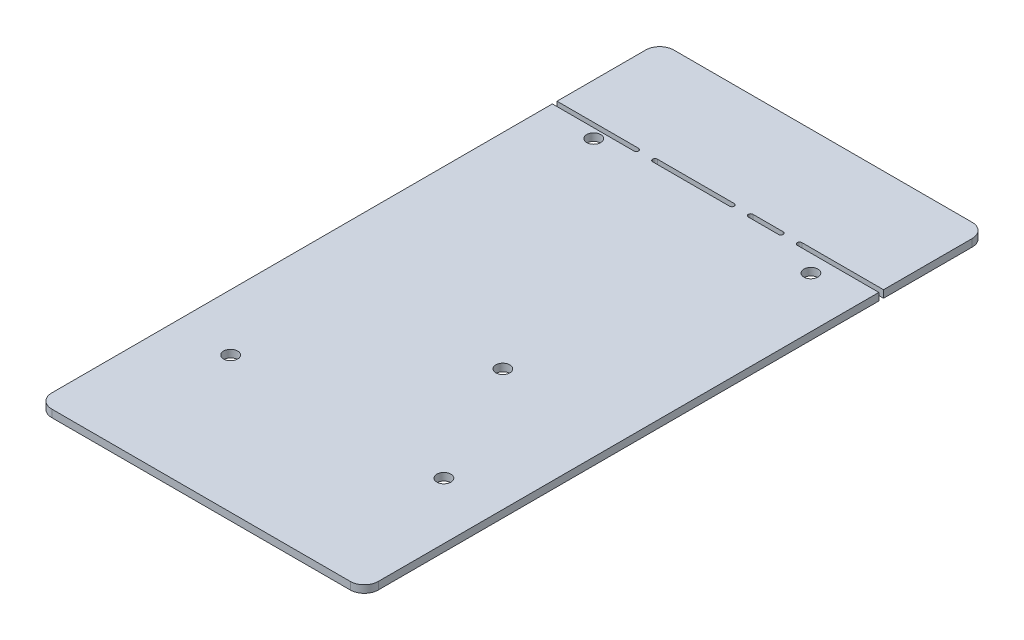
ISO-10303-21;
HEADER;
FILE_DESCRIPTION(('STEP AP214'),'2;1');
FILE_NAME('part.step','',(''),(''),'','','');
FILE_SCHEMA(('AUTOMOTIVE_DESIGN { 1 0 10303 214 1 1 1 1 }'));
ENDSEC;
DATA;
#1=APPLICATION_CONTEXT('core data for automotive mechanical design processes');
#2=APPLICATION_PROTOCOL_DEFINITION('international standard','automotive_design',2000,#1);
#3=PRODUCT_CONTEXT('',#1,'mechanical');
#4=PRODUCT('Part','Part','',(#3));
#5=PRODUCT_RELATED_PRODUCT_CATEGORY('part','',(#4));
#6=PRODUCT_DEFINITION_FORMATION('','',#4);
#7=PRODUCT_DEFINITION_CONTEXT('part definition',#1,'design');
#8=PRODUCT_DEFINITION('design','',#6,#7);
#9=PRODUCT_DEFINITION_SHAPE('','',#8);
#10=(LENGTH_UNIT() NAMED_UNIT(*) SI_UNIT(.MILLI.,.METRE.));
#11=(NAMED_UNIT(*) PLANE_ANGLE_UNIT() SI_UNIT($,.RADIAN.));
#12=(NAMED_UNIT(*) SI_UNIT($,.STERADIAN.) SOLID_ANGLE_UNIT());
#13=UNCERTAINTY_MEASURE_WITH_UNIT(LENGTH_MEASURE(1.E-05),#10,'distance_accuracy_value','');
#14=(GEOMETRIC_REPRESENTATION_CONTEXT(3) GLOBAL_UNCERTAINTY_ASSIGNED_CONTEXT((#13)) GLOBAL_UNIT_ASSIGNED_CONTEXT((#10,
#11,#12)) REPRESENTATION_CONTEXT('',''));
#15=CARTESIAN_POINT('',(0.,0.,0.));
#16=DIRECTION('',(0.,0.,1.));
#17=DIRECTION('',(1.,0.,0.));
#18=AXIS2_PLACEMENT_3D('',#15,#16,#17);
#19=CARTESIAN_POINT('',(35.,1.6,-66.67));
#20=DIRECTION('',(-1.,0.,0.));
#21=DIRECTION('',(0.,0.,1.));
#22=AXIS2_PLACEMENT_3D('',#19,#20,#21);
#23=PLANE('',#22);
#24=DIRECTION('',(0.,0.,-1.));
#25=VECTOR('',#24,1.);
#26=CARTESIAN_POINT('',(35.,0.,-66.67));
#27=LINE('',#26,#25);
#28=CARTESIAN_POINT('',(35.,0.,-44.65));
#29=VERTEX_POINT('',#28);
#30=CARTESIAN_POINT('',(35.,0.,-63.67));
#31=VERTEX_POINT('',#30);
#32=EDGE_CURVE('E253',#29,#31,#27,.T.);
#33=ORIENTED_EDGE('',*,*,#32,.T.);
#34=DIRECTION('',(0.,-1.,0.));
#35=VECTOR('',#34,1.);
#36=CARTESIAN_POINT('',(35.,1.6,-63.67));
#37=LINE('',#36,#35);
#38=CARTESIAN_POINT('',(35.,1.6,-63.67));
#39=VERTEX_POINT('',#38);
#40=EDGE_CURVE('E356',#31,#39,#37,.F.);
#41=ORIENTED_EDGE('',*,*,#40,.T.);
#42=DIRECTION('',(0.,0.,-1.));
#43=VECTOR('',#42,1.);
#44=CARTESIAN_POINT('',(35.,1.6,-66.67));
#45=LINE('',#44,#43);
#46=CARTESIAN_POINT('',(35.,1.6,-44.65));
#47=VERTEX_POINT('',#46);
#48=EDGE_CURVE('E308',#47,#39,#45,.T.);
#49=ORIENTED_EDGE('',*,*,#48,.F.);
#50=DIRECTION('',(0.,1.,0.));
#51=VECTOR('',#50,1.);
#52=CARTESIAN_POINT('',(35.,0.,-44.65));
#53=LINE('',#52,#51);
#54=EDGE_CURVE('E259',#29,#47,#53,.T.);
#55=ORIENTED_EDGE('',*,*,#54,.F.);
#56=EDGE_LOOP('',(#33,#41,#49,#55));
#57=FACE_BOUND('',#56,.T.);
#58=ADVANCED_FACE('F35',(#57),#23,.F.);
#59=CARTESIAN_POINT('',(-35.,1.6,-66.67));
#60=DIRECTION('',(1.,0.,0.));
#61=DIRECTION('',(0.,0.,-1.));
#62=AXIS2_PLACEMENT_3D('',#59,#60,#61);
#63=PLANE('',#62);
#64=DIRECTION('',(0.,0.,1.));
#65=VECTOR('',#64,1.);
#66=CARTESIAN_POINT('',(-35.,1.6,-66.67));
#67=LINE('',#66,#65);
#68=CARTESIAN_POINT('',(-35.,1.6,-63.67));
#69=VERTEX_POINT('',#68);
#70=CARTESIAN_POINT('',(-35.,1.6,-44.65));
#71=VERTEX_POINT('',#70);
#72=EDGE_CURVE('E312',#69,#71,#67,.T.);
#73=ORIENTED_EDGE('',*,*,#72,.F.);
#74=DIRECTION('',(0.,-1.,0.));
#75=VECTOR('',#74,1.);
#76=CARTESIAN_POINT('',(-35.,1.6,-63.67));
#77=LINE('',#76,#75);
#78=CARTESIAN_POINT('',(-35.,0.,-63.67));
#79=VERTEX_POINT('',#78);
#80=EDGE_CURVE('E358',#69,#79,#77,.T.);
#81=ORIENTED_EDGE('',*,*,#80,.T.);
#82=DIRECTION('',(0.,0.,1.));
#83=VECTOR('',#82,1.);
#84=CARTESIAN_POINT('',(-35.,0.,-66.67));
#85=LINE('',#84,#83);
#86=CARTESIAN_POINT('',(-35.,0.,-44.65));
#87=VERTEX_POINT('',#86);
#88=EDGE_CURVE('E321',#79,#87,#85,.T.);
#89=ORIENTED_EDGE('',*,*,#88,.T.);
#90=DIRECTION('',(0.,1.,0.));
#91=VECTOR('',#90,1.);
#92=CARTESIAN_POINT('',(-35.,0.,-44.65));
#93=LINE('',#92,#91);
#94=EDGE_CURVE('E272',#87,#71,#93,.T.);
#95=ORIENTED_EDGE('',*,*,#94,.T.);
#96=EDGE_LOOP('',(#73,#81,#89,#95));
#97=FACE_BOUND('',#96,.T.);
#98=ADVANCED_FACE('F528',(#97),#63,.F.);
#99=CARTESIAN_POINT('',(35.,1.6,63.67));
#100=VERTEX_POINT('',#99);
#101=CARTESIAN_POINT('',(35.,1.6,-43.65));
#102=VERTEX_POINT('',#101);
#103=EDGE_CURVE('E305',#100,#102,#45,.T.);
#104=ORIENTED_EDGE('',*,*,#103,.F.);
#105=DIRECTION('',(0.,-1.,0.));
#106=VECTOR('',#105,1.);
#107=CARTESIAN_POINT('',(35.,1.6,63.67));
#108=LINE('',#107,#106);
#109=CARTESIAN_POINT('',(35.,0.,63.67));
#110=VERTEX_POINT('',#109);
#111=EDGE_CURVE('E251',#100,#110,#108,.T.);
#112=ORIENTED_EDGE('',*,*,#111,.T.);
#113=CARTESIAN_POINT('',(35.,0.,-43.65));
#114=VERTEX_POINT('',#113);
#115=EDGE_CURVE('E236',#110,#114,#27,.T.);
#116=ORIENTED_EDGE('',*,*,#115,.T.);
#117=DIRECTION('',(0.,1.,0.));
#118=VECTOR('',#117,1.);
#119=CARTESIAN_POINT('',(35.,0.,-43.65));
#120=LINE('',#119,#118);
#121=EDGE_CURVE('E242',#114,#102,#120,.T.);
#122=ORIENTED_EDGE('',*,*,#121,.T.);
#123=EDGE_LOOP('',(#104,#112,#116,#122));
#124=FACE_BOUND('',#123,.T.);
#125=ADVANCED_FACE('F249',(#124),#23,.F.);
#126=CARTESIAN_POINT('',(-35.,1.6,-66.67));
#127=DIRECTION('',(0.,0.,1.));
#128=DIRECTION('',(1.,0.,0.));
#129=AXIS2_PLACEMENT_3D('',#126,#127,#128);
#130=PLANE('',#129);
#131=DIRECTION('',(-1.,0.,0.));
#132=VECTOR('',#131,1.);
#133=CARTESIAN_POINT('',(-35.,1.6,-66.67));
#134=LINE('',#133,#132);
#135=CARTESIAN_POINT('',(32.,1.6,-66.67));
#136=VERTEX_POINT('',#135);
#137=CARTESIAN_POINT('',(-32.,1.6,-66.67));
#138=VERTEX_POINT('',#137);
#139=EDGE_CURVE('E307',#136,#138,#134,.T.);
#140=ORIENTED_EDGE('',*,*,#139,.F.);
#141=DIRECTION('',(0.,-1.,0.));
#142=VECTOR('',#141,1.);
#143=CARTESIAN_POINT('',(32.,1.6,-66.67));
#144=LINE('',#143,#142);
#145=CARTESIAN_POINT('',(32.,0.,-66.67));
#146=VERTEX_POINT('',#145);
#147=EDGE_CURVE('E353',#136,#146,#144,.T.);
#148=ORIENTED_EDGE('',*,*,#147,.T.);
#149=DIRECTION('',(-1.,0.,0.));
#150=VECTOR('',#149,1.);
#151=CARTESIAN_POINT('',(-35.,0.,-66.67));
#152=LINE('',#151,#150);
#153=CARTESIAN_POINT('',(-32.,0.,-66.67));
#154=VERTEX_POINT('',#153);
#155=EDGE_CURVE('E252',#146,#154,#152,.T.);
#156=ORIENTED_EDGE('',*,*,#155,.T.);
#157=DIRECTION('',(0.,-1.,0.));
#158=VECTOR('',#157,1.);
#159=CARTESIAN_POINT('',(-32.,1.6,-66.67));
#160=LINE('',#159,#158);
#161=EDGE_CURVE('E351',#154,#138,#160,.F.);
#162=ORIENTED_EDGE('',*,*,#161,.T.);
#163=EDGE_LOOP('',(#140,#148,#156,#162));
#164=FACE_BOUND('',#163,.T.);
#165=ADVANCED_FACE('F541',(#164),#130,.F.);
#166=CARTESIAN_POINT('',(-35.,0.,-43.65));
#167=VERTEX_POINT('',#166);
#168=CARTESIAN_POINT('',(-35.,0.,63.67));
#169=VERTEX_POINT('',#168);
#170=EDGE_CURVE('E320',#167,#169,#85,.T.);
#171=ORIENTED_EDGE('',*,*,#170,.T.);
#172=DIRECTION('',(0.,-1.,0.));
#173=VECTOR('',#172,1.);
#174=CARTESIAN_POINT('',(-35.,1.6,63.67));
#175=LINE('',#174,#173);
#176=CARTESIAN_POINT('',(-35.,1.6,63.67));
#177=VERTEX_POINT('',#176);
#178=EDGE_CURVE('E349',#169,#177,#175,.F.);
#179=ORIENTED_EDGE('',*,*,#178,.T.);
#180=CARTESIAN_POINT('',(-35.,1.6,-43.65));
#181=VERTEX_POINT('',#180);
#182=EDGE_CURVE('E311',#181,#177,#67,.T.);
#183=ORIENTED_EDGE('',*,*,#182,.F.);
#184=DIRECTION('',(0.,1.,0.));
#185=VECTOR('',#184,1.);
#186=CARTESIAN_POINT('',(-35.,0.,-43.65));
#187=LINE('',#186,#185);
#188=EDGE_CURVE('E279',#167,#181,#187,.T.);
#189=ORIENTED_EDGE('',*,*,#188,.F.);
#190=EDGE_LOOP('',(#171,#179,#183,#189));
#191=FACE_BOUND('',#190,.T.);
#192=ADVANCED_FACE('F536',(#191),#63,.F.);
#193=CARTESIAN_POINT('',(-35.,1.6,66.67));
#194=DIRECTION('',(0.,0.,-1.));
#195=DIRECTION('',(-1.,0.,0.));
#196=AXIS2_PLACEMENT_3D('',#193,#194,#195);
#197=PLANE('',#196);
#198=DIRECTION('',(1.,0.,0.));
#199=VECTOR('',#198,1.);
#200=CARTESIAN_POINT('',(-35.,0.,66.67));
#201=LINE('',#200,#199);
#202=CARTESIAN_POINT('',(-32.,0.,66.67));
#203=VERTEX_POINT('',#202);
#204=CARTESIAN_POINT('',(32.,0.,66.67));
#205=VERTEX_POINT('',#204);
#206=EDGE_CURVE('E324',#203,#205,#201,.T.);
#207=ORIENTED_EDGE('',*,*,#206,.T.);
#208=DIRECTION('',(0.,-1.,0.));
#209=VECTOR('',#208,1.);
#210=CARTESIAN_POINT('',(32.,1.6,66.67));
#211=LINE('',#210,#209);
#212=CARTESIAN_POINT('',(32.,1.6,66.67));
#213=VERTEX_POINT('',#212);
#214=EDGE_CURVE('E339',#205,#213,#211,.F.);
#215=ORIENTED_EDGE('',*,*,#214,.T.);
#216=DIRECTION('',(1.,0.,0.));
#217=VECTOR('',#216,1.);
#218=CARTESIAN_POINT('',(-35.,1.6,66.67));
#219=LINE('',#218,#217);
#220=CARTESIAN_POINT('',(-32.,1.6,66.67));
#221=VERTEX_POINT('',#220);
#222=EDGE_CURVE('E315',#221,#213,#219,.T.);
#223=ORIENTED_EDGE('',*,*,#222,.F.);
#224=DIRECTION('',(0.,-1.,0.));
#225=VECTOR('',#224,1.);
#226=CARTESIAN_POINT('',(-32.,1.6,66.67));
#227=LINE('',#226,#225);
#228=EDGE_CURVE('E336',#221,#203,#227,.T.);
#229=ORIENTED_EDGE('',*,*,#228,.T.);
#230=EDGE_LOOP('',(#207,#215,#223,#229));
#231=FACE_BOUND('',#230,.T.);
#232=ADVANCED_FACE('F549',(#231),#197,.F.);
#233=CARTESIAN_POINT('',(0.,1.6,0.));
#234=DIRECTION('',(0.,1.,0.));
#235=DIRECTION('',(0.,0.,1.));
#236=AXIS2_PLACEMENT_3D('',#233,#234,#235);
#237=PLANE('',#236);
#238=ORIENTED_EDGE('',*,*,#222,.T.);
#239=CARTESIAN_POINT('',(32.,1.6,63.67));
#240=DIRECTION('',(0.,1.,0.));
#241=DIRECTION('',(0.,0.,1.));
#242=AXIS2_PLACEMENT_3D('',#239,#240,#241);
#243=CIRCLE('',#242,3.);
#244=EDGE_CURVE('E347',#213,#100,#243,.T.);
#245=ORIENTED_EDGE('',*,*,#244,.T.);
#246=ORIENTED_EDGE('',*,*,#103,.T.);
#247=DIRECTION('',(1.,0.,0.));
#248=VECTOR('',#247,1.);
#249=CARTESIAN_POINT('',(35.,1.6,-43.65));
#250=LINE('',#249,#248);
#251=CARTESIAN_POINT('',(17.5,1.6,-43.65));
#252=VERTEX_POINT('',#251);
#253=EDGE_CURVE('E257',#252,#102,#250,.T.);
#254=ORIENTED_EDGE('',*,*,#253,.F.);
#255=CARTESIAN_POINT('',(17.5,1.6,-44.15));
#256=DIRECTION('',(0.,1.,0.));
#257=DIRECTION('',(0.,0.,1.));
#258=AXIS2_PLACEMENT_3D('',#255,#256,#257);
#259=CIRCLE('',#258,0.5);
#260=CARTESIAN_POINT('',(17.,1.6,-44.15));
#261=VERTEX_POINT('',#260);
#262=EDGE_CURVE('E395',#252,#261,#259,.F.);
#263=ORIENTED_EDGE('',*,*,#262,.T.);
#264=CARTESIAN_POINT('',(17.5,1.6,-44.15));
#265=DIRECTION('',(0.,1.,0.));
#266=DIRECTION('',(0.,0.,1.));
#267=AXIS2_PLACEMENT_3D('',#264,#265,#266);
#268=CIRCLE('',#267,0.5);
#269=CARTESIAN_POINT('',(17.5,1.6,-44.65));
#270=VERTEX_POINT('',#269);
#271=EDGE_CURVE('E391',#261,#270,#268,.F.);
#272=ORIENTED_EDGE('',*,*,#271,.T.);
#273=DIRECTION('',(-1.,0.,0.));
#274=VECTOR('',#273,1.);
#275=CARTESIAN_POINT('',(35.,1.6,-44.65));
#276=LINE('',#275,#274);
#277=EDGE_CURVE('E478',#47,#270,#276,.T.);
#278=ORIENTED_EDGE('',*,*,#277,.F.);
#279=ORIENTED_EDGE('',*,*,#48,.T.);
#280=CARTESIAN_POINT('',(32.,1.6,-63.67));
#281=DIRECTION('',(0.,1.,0.));
#282=DIRECTION('',(0.,0.,1.));
#283=AXIS2_PLACEMENT_3D('',#280,#281,#282);
#284=CIRCLE('',#283,3.);
#285=EDGE_CURVE('E343',#39,#136,#284,.T.);
#286=ORIENTED_EDGE('',*,*,#285,.T.);
#287=ORIENTED_EDGE('',*,*,#139,.T.);
#288=CARTESIAN_POINT('',(-32.,1.6,-63.67));
#289=DIRECTION('',(0.,1.,0.));
#290=DIRECTION('',(0.,0.,1.));
#291=AXIS2_PLACEMENT_3D('',#288,#289,#290);
#292=CIRCLE('',#291,3.);
#293=EDGE_CURVE('E341',#138,#69,#292,.T.);
#294=ORIENTED_EDGE('',*,*,#293,.T.);
#295=ORIENTED_EDGE('',*,*,#72,.T.);
#296=DIRECTION('',(-1.,0.,0.));
#297=VECTOR('',#296,1.);
#298=CARTESIAN_POINT('',(-35.,1.6,-44.65));
#299=LINE('',#298,#297);
#300=CARTESIAN_POINT('',(-17.5,1.6,-44.65));
#301=VERTEX_POINT('',#300);
#302=EDGE_CURVE('E277',#301,#71,#299,.T.);
#303=ORIENTED_EDGE('',*,*,#302,.F.);
#304=CARTESIAN_POINT('',(-17.5,1.6,-44.15));
#305=DIRECTION('',(0.,1.,0.));
#306=DIRECTION('',(0.,0.,1.));
#307=AXIS2_PLACEMENT_3D('',#304,#305,#306);
#308=CIRCLE('',#307,0.5);
#309=CARTESIAN_POINT('',(-17.,1.6,-44.15));
#310=VERTEX_POINT('',#309);
#311=EDGE_CURVE('E422',#301,#310,#308,.F.);
#312=ORIENTED_EDGE('',*,*,#311,.T.);
#313=CARTESIAN_POINT('',(-17.5,1.6,-44.15));
#314=DIRECTION('',(0.,1.,0.));
#315=DIRECTION('',(0.,0.,1.));
#316=AXIS2_PLACEMENT_3D('',#313,#314,#315);
#317=CIRCLE('',#316,0.5);
#318=CARTESIAN_POINT('',(-17.5,1.6,-43.65));
#319=VERTEX_POINT('',#318);
#320=EDGE_CURVE('E426',#310,#319,#317,.F.);
#321=ORIENTED_EDGE('',*,*,#320,.T.);
#322=DIRECTION('',(1.,0.,0.));
#323=VECTOR('',#322,1.);
#324=CARTESIAN_POINT('',(-35.,1.6,-43.65));
#325=LINE('',#324,#323);
#326=EDGE_CURVE('E280',#181,#319,#325,.T.);
#327=ORIENTED_EDGE('',*,*,#326,.F.);
#328=ORIENTED_EDGE('',*,*,#182,.T.);
#329=CARTESIAN_POINT('',(-32.,1.6,63.67));
#330=DIRECTION('',(0.,1.,0.));
#331=DIRECTION('',(0.,0.,1.));
#332=AXIS2_PLACEMENT_3D('',#329,#330,#331);
#333=CIRCLE('',#332,3.);
#334=EDGE_CURVE('E345',#177,#221,#333,.T.);
#335=ORIENTED_EDGE('',*,*,#334,.T.);
#336=EDGE_LOOP('',(#238,#245,#246,#254,#263,#272,#278,#279,#286,#287,#294,#295,#303,#312,#321,
#327,#328,#335));
#337=FACE_BOUND('',#336,.T.);
#338=CARTESIAN_POINT('',(24.13,1.6,-39.95));
#339=DIRECTION('',(0.,1.,0.));
#340=DIRECTION('',(0.,0.,1.));
#341=AXIS2_PLACEMENT_3D('',#338,#339,#340);
#342=CIRCLE('',#341,1.5);
#343=CARTESIAN_POINT('',(24.13,1.6,-38.45));
#344=VERTEX_POINT('',#343);
#345=EDGE_CURVE('E269',#344,#344,#342,.T.);
#346=ORIENTED_EDGE('',*,*,#345,.F.);
#347=EDGE_LOOP('',(#346));
#348=FACE_BOUND('',#347,.T.);
#349=CARTESIAN_POINT('',(-24.13,1.6,-41.65));
#350=DIRECTION('',(0.,1.,0.));
#351=DIRECTION('',(0.,0.,1.));
#352=AXIS2_PLACEMENT_3D('',#349,#350,#351);
#353=CIRCLE('',#352,1.5);
#354=CARTESIAN_POINT('',(-24.13,1.6,-40.15));
#355=VERTEX_POINT('',#354);
#356=EDGE_CURVE('E268',#355,#355,#353,.T.);
#357=ORIENTED_EDGE('',*,*,#356,.F.);
#358=EDGE_LOOP('',(#357));
#359=FACE_BOUND('',#358,.T.);
#360=CARTESIAN_POINT('',(22.86,1.6,37.46));
#361=DIRECTION('',(0.,1.,0.));
#362=DIRECTION('',(0.,0.,-1.));
#363=AXIS2_PLACEMENT_3D('',#360,#361,#362);
#364=CIRCLE('',#363,1.5);
#365=CARTESIAN_POINT('',(22.86,1.6,35.96));
#366=VERTEX_POINT('',#365);
#367=EDGE_CURVE('E292',#366,#366,#364,.T.);
#368=ORIENTED_EDGE('',*,*,#367,.F.);
#369=EDGE_LOOP('',(#368));
#370=FACE_BOUND('',#369,.T.);
#371=CARTESIAN_POINT('',(8.88999999999999,1.6,10.85));
#372=DIRECTION('',(0.,1.,0.));
#373=DIRECTION('',(0.,0.,1.));
#374=AXIS2_PLACEMENT_3D('',#371,#372,#373);
#375=CIRCLE('',#374,1.5);
#376=CARTESIAN_POINT('',(8.88999999999999,1.6,12.35));
#377=VERTEX_POINT('',#376);
#378=EDGE_CURVE('E437',#377,#377,#375,.T.);
#379=ORIENTED_EDGE('',*,*,#378,.F.);
#380=EDGE_LOOP('',(#379));
#381=FACE_BOUND('',#380,.T.);
#382=DIRECTION('',(1.,0.,0.));
#383=VECTOR('',#382,1.);
#384=CARTESIAN_POINT('',(6.5,1.6,-43.65));
#385=LINE('',#384,#383);
#386=CARTESIAN_POINT('',(7.,1.6,-43.65));
#387=VERTEX_POINT('',#386);
#388=CARTESIAN_POINT('',(13.5,1.6,-43.65));
#389=VERTEX_POINT('',#388);
#390=EDGE_CURVE('E493',#387,#389,#385,.T.);
#391=ORIENTED_EDGE('',*,*,#390,.F.);
#392=CARTESIAN_POINT('',(7.,1.6,-44.15));
#393=DIRECTION('',(0.,1.,0.));
#394=DIRECTION('',(0.,0.,1.));
#395=AXIS2_PLACEMENT_3D('',#392,#393,#394);
#396=CIRCLE('',#395,0.5);
#397=CARTESIAN_POINT('',(6.5,1.6,-44.15));
#398=VERTEX_POINT('',#397);
#399=EDGE_CURVE('E410',#387,#398,#396,.F.);
#400=ORIENTED_EDGE('',*,*,#399,.T.);
#401=CARTESIAN_POINT('',(7.,1.6,-44.15));
#402=DIRECTION('',(0.,1.,0.));
#403=DIRECTION('',(0.,0.,1.));
#404=AXIS2_PLACEMENT_3D('',#401,#402,#403);
#405=CIRCLE('',#404,0.5);
#406=CARTESIAN_POINT('',(7.,1.6,-44.65));
#407=VERTEX_POINT('',#406);
#408=EDGE_CURVE('E406',#398,#407,#405,.F.);
#409=ORIENTED_EDGE('',*,*,#408,.T.);
#410=DIRECTION('',(-1.,0.,0.));
#411=VECTOR('',#410,1.);
#412=CARTESIAN_POINT('',(6.5,1.6,-44.65));
#413=LINE('',#412,#411);
#414=CARTESIAN_POINT('',(13.5,1.6,-44.65));
#415=VERTEX_POINT('',#414);
#416=EDGE_CURVE('E490',#415,#407,#413,.T.);
#417=ORIENTED_EDGE('',*,*,#416,.F.);
#418=CARTESIAN_POINT('',(13.5,1.6,-44.15));
#419=DIRECTION('',(0.,1.,0.));
#420=DIRECTION('',(0.,0.,1.));
#421=AXIS2_PLACEMENT_3D('',#418,#419,#420);
#422=CIRCLE('',#421,0.5);
#423=CARTESIAN_POINT('',(14.,1.6,-44.15));
#424=VERTEX_POINT('',#423);
#425=EDGE_CURVE('E402',#415,#424,#422,.F.);
#426=ORIENTED_EDGE('',*,*,#425,.T.);
#427=CARTESIAN_POINT('',(13.5,1.6,-44.15));
#428=DIRECTION('',(0.,1.,0.));
#429=DIRECTION('',(0.,0.,1.));
#430=AXIS2_PLACEMENT_3D('',#427,#428,#429);
#431=CIRCLE('',#430,0.5);
#432=EDGE_CURVE('E398',#424,#389,#431,.F.);
#433=ORIENTED_EDGE('',*,*,#432,.T.);
#434=EDGE_LOOP('',(#391,#400,#409,#417,#426,#433));
#435=FACE_BOUND('',#434,.T.);
#436=CARTESIAN_POINT('',(-13.5,1.6,-44.15));
#437=DIRECTION('',(0.,1.,0.));
#438=DIRECTION('',(0.,0.,1.));
#439=AXIS2_PLACEMENT_3D('',#436,#437,#438);
#440=CIRCLE('',#439,0.5);
#441=CARTESIAN_POINT('',(-13.5,1.6,-43.65));
#442=VERTEX_POINT('',#441);
#443=CARTESIAN_POINT('',(-14.,1.6,-44.15));
#444=VERTEX_POINT('',#443);
#445=EDGE_CURVE('E58',#442,#444,#440,.F.);
#446=ORIENTED_EDGE('',*,*,#445,.T.);
#447=CARTESIAN_POINT('',(-13.5,1.6,-44.15));
#448=DIRECTION('',(0.,1.,0.));
#449=DIRECTION('',(0.,0.,1.));
#450=AXIS2_PLACEMENT_3D('',#447,#448,#449);
#451=CIRCLE('',#450,0.5);
#452=CARTESIAN_POINT('',(-13.5,1.6,-44.65));
#453=VERTEX_POINT('',#452);
#454=EDGE_CURVE('E44',#444,#453,#451,.F.);
#455=ORIENTED_EDGE('',*,*,#454,.T.);
#456=DIRECTION('',(-1.,0.,0.));
#457=VECTOR('',#456,1.);
#458=CARTESIAN_POINT('',(-14.,1.6,-44.65));
#459=LINE('',#458,#457);
#460=CARTESIAN_POINT('',(3.,1.6,-44.65));
#461=VERTEX_POINT('',#460);
#462=EDGE_CURVE('E462',#461,#453,#459,.T.);
#463=ORIENTED_EDGE('',*,*,#462,.F.);
#464=CARTESIAN_POINT('',(3.,1.6,-44.15));
#465=DIRECTION('',(0.,1.,0.));
#466=DIRECTION('',(0.,0.,1.));
#467=AXIS2_PLACEMENT_3D('',#464,#465,#466);
#468=CIRCLE('',#467,0.5);
#469=CARTESIAN_POINT('',(3.5,1.6,-44.15));
#470=VERTEX_POINT('',#469);
#471=EDGE_CURVE('E418',#461,#470,#468,.F.);
#472=ORIENTED_EDGE('',*,*,#471,.T.);
#473=CARTESIAN_POINT('',(3.,1.6,-44.15));
#474=DIRECTION('',(0.,1.,0.));
#475=DIRECTION('',(0.,0.,1.));
#476=AXIS2_PLACEMENT_3D('',#473,#474,#475);
#477=CIRCLE('',#476,0.5);
#478=CARTESIAN_POINT('',(3.,1.6,-43.65));
#479=VERTEX_POINT('',#478);
#480=EDGE_CURVE('E414',#470,#479,#477,.F.);
#481=ORIENTED_EDGE('',*,*,#480,.T.);
#482=DIRECTION('',(1.,0.,0.));
#483=VECTOR('',#482,1.);
#484=CARTESIAN_POINT('',(-14.,1.6,-43.65));
#485=LINE('',#484,#483);
#486=EDGE_CURVE('E261',#442,#479,#485,.T.);
#487=ORIENTED_EDGE('',*,*,#486,.F.);
#488=EDGE_LOOP('',(#446,#455,#463,#472,#481,#487));
#489=FACE_BOUND('',#488,.T.);
#490=CARTESIAN_POINT('',(-22.86,1.6,37.46));
#491=DIRECTION('',(0.,1.,0.));
#492=DIRECTION('',(0.,0.,1.));
#493=AXIS2_PLACEMENT_3D('',#490,#491,#492);
#494=CIRCLE('',#493,1.5);
#495=CARTESIAN_POINT('',(-22.86,1.6,38.96));
#496=VERTEX_POINT('',#495);
#497=EDGE_CURVE('E291',#496,#496,#494,.T.);
#498=ORIENTED_EDGE('',*,*,#497,.F.);
#499=EDGE_LOOP('',(#498));
#500=FACE_BOUND('',#499,.T.);
#501=ADVANCED_FACE('F460',(#337,#348,#359,#370,#381,#435,#489,#500),#237,.T.);
#502=CARTESIAN_POINT('',(0.,0.,0.));
#503=DIRECTION('',(0.,1.,0.));
#504=DIRECTION('',(0.,0.,1.));
#505=AXIS2_PLACEMENT_3D('',#502,#503,#504);
#506=PLANE('',#505);
#507=CARTESIAN_POINT('',(24.13,0.,-39.95));
#508=DIRECTION('',(0.,1.,0.));
#509=DIRECTION('',(0.,0.,1.));
#510=AXIS2_PLACEMENT_3D('',#507,#508,#509);
#511=CIRCLE('',#510,1.5);
#512=CARTESIAN_POINT('',(24.13,0.,-38.45));
#513=VERTEX_POINT('',#512);
#514=EDGE_CURVE('E265',#513,#513,#511,.T.);
#515=ORIENTED_EDGE('',*,*,#514,.T.);
#516=EDGE_LOOP('',(#515));
#517=FACE_BOUND('',#516,.T.);
#518=CARTESIAN_POINT('',(-24.13,0.,-41.65));
#519=DIRECTION('',(0.,1.,0.));
#520=DIRECTION('',(0.,0.,1.));
#521=AXIS2_PLACEMENT_3D('',#518,#519,#520);
#522=CIRCLE('',#521,1.5);
#523=CARTESIAN_POINT('',(-24.13,0.,-40.15));
#524=VERTEX_POINT('',#523);
#525=EDGE_CURVE('E295',#524,#524,#522,.T.);
#526=ORIENTED_EDGE('',*,*,#525,.T.);
#527=EDGE_LOOP('',(#526));
#528=FACE_BOUND('',#527,.T.);
#529=CARTESIAN_POINT('',(22.86,0.,37.46));
#530=DIRECTION('',(0.,1.,0.));
#531=DIRECTION('',(0.,0.,-1.));
#532=AXIS2_PLACEMENT_3D('',#529,#530,#531);
#533=CIRCLE('',#532,1.5);
#534=CARTESIAN_POINT('',(22.86,0.,35.96));
#535=VERTEX_POINT('',#534);
#536=EDGE_CURVE('E288',#535,#535,#533,.T.);
#537=ORIENTED_EDGE('',*,*,#536,.T.);
#538=EDGE_LOOP('',(#537));
#539=FACE_BOUND('',#538,.T.);
#540=CARTESIAN_POINT('',(8.88999999999999,0.,10.85));
#541=DIRECTION('',(0.,1.,0.));
#542=DIRECTION('',(0.,0.,1.));
#543=AXIS2_PLACEMENT_3D('',#540,#541,#542);
#544=CIRCLE('',#543,1.5);
#545=CARTESIAN_POINT('',(8.88999999999999,0.,12.35));
#546=VERTEX_POINT('',#545);
#547=EDGE_CURVE('E496',#546,#546,#544,.T.);
#548=ORIENTED_EDGE('',*,*,#547,.T.);
#549=EDGE_LOOP('',(#548));
#550=FACE_BOUND('',#549,.T.);
#551=CARTESIAN_POINT('',(13.5,0.,-44.15));
#552=DIRECTION('',(0.,1.,0.));
#553=DIRECTION('',(0.,0.,1.));
#554=AXIS2_PLACEMENT_3D('',#551,#552,#553);
#555=CIRCLE('',#554,0.5);
#556=CARTESIAN_POINT('',(13.5,0.,-43.65));
#557=VERTEX_POINT('',#556);
#558=CARTESIAN_POINT('',(14.,0.,-44.15));
#559=VERTEX_POINT('',#558);
#560=EDGE_CURVE('E400',#557,#559,#555,.T.);
#561=ORIENTED_EDGE('',*,*,#560,.T.);
#562=CARTESIAN_POINT('',(13.5,0.,-44.15));
#563=DIRECTION('',(0.,1.,0.));
#564=DIRECTION('',(0.,0.,1.));
#565=AXIS2_PLACEMENT_3D('',#562,#563,#564);
#566=CIRCLE('',#565,0.5);
#567=CARTESIAN_POINT('',(13.5,0.,-44.65));
#568=VERTEX_POINT('',#567);
#569=EDGE_CURVE('E404',#559,#568,#566,.T.);
#570=ORIENTED_EDGE('',*,*,#569,.T.);
#571=DIRECTION('',(-1.,0.,0.));
#572=VECTOR('',#571,1.);
#573=CARTESIAN_POINT('',(6.5,0.,-44.65));
#574=LINE('',#573,#572);
#575=CARTESIAN_POINT('',(7.,0.,-44.65));
#576=VERTEX_POINT('',#575);
#577=EDGE_CURVE('E480',#568,#576,#574,.T.);
#578=ORIENTED_EDGE('',*,*,#577,.T.);
#579=CARTESIAN_POINT('',(7.,0.,-44.15));
#580=DIRECTION('',(0.,1.,0.));
#581=DIRECTION('',(0.,0.,1.));
#582=AXIS2_PLACEMENT_3D('',#579,#580,#581);
#583=CIRCLE('',#582,0.5);
#584=CARTESIAN_POINT('',(6.5,0.,-44.15));
#585=VERTEX_POINT('',#584);
#586=EDGE_CURVE('E408',#576,#585,#583,.T.);
#587=ORIENTED_EDGE('',*,*,#586,.T.);
#588=CARTESIAN_POINT('',(7.,0.,-44.15));
#589=DIRECTION('',(0.,1.,0.));
#590=DIRECTION('',(0.,0.,1.));
#591=AXIS2_PLACEMENT_3D('',#588,#589,#590);
#592=CIRCLE('',#591,0.5);
#593=CARTESIAN_POINT('',(7.,0.,-43.65));
#594=VERTEX_POINT('',#593);
#595=EDGE_CURVE('E412',#585,#594,#592,.T.);
#596=ORIENTED_EDGE('',*,*,#595,.T.);
#597=DIRECTION('',(1.,0.,0.));
#598=VECTOR('',#597,1.);
#599=CARTESIAN_POINT('',(6.5,0.,-43.65));
#600=LINE('',#599,#598);
#601=EDGE_CURVE('E485',#594,#557,#600,.T.);
#602=ORIENTED_EDGE('',*,*,#601,.T.);
#603=EDGE_LOOP('',(#561,#570,#578,#587,#596,#602));
#604=FACE_BOUND('',#603,.T.);
#605=ORIENTED_EDGE('',*,*,#115,.F.);
#606=CARTESIAN_POINT('',(32.,0.,63.67));
#607=DIRECTION('',(0.,1.,0.));
#608=DIRECTION('',(0.,0.,1.));
#609=AXIS2_PLACEMENT_3D('',#606,#607,#608);
#610=CIRCLE('',#609,3.);
#611=EDGE_CURVE('E334',#110,#205,#610,.F.);
#612=ORIENTED_EDGE('',*,*,#611,.T.);
#613=ORIENTED_EDGE('',*,*,#206,.F.);
#614=CARTESIAN_POINT('',(-32.,0.,63.67));
#615=DIRECTION('',(0.,1.,0.));
#616=DIRECTION('',(0.,0.,1.));
#617=AXIS2_PLACEMENT_3D('',#614,#615,#616);
#618=CIRCLE('',#617,3.);
#619=EDGE_CURVE('E332',#203,#169,#618,.F.);
#620=ORIENTED_EDGE('',*,*,#619,.T.);
#621=ORIENTED_EDGE('',*,*,#170,.F.);
#622=DIRECTION('',(1.,0.,0.));
#623=VECTOR('',#622,1.);
#624=CARTESIAN_POINT('',(-35.,0.,-43.65));
#625=LINE('',#624,#623);
#626=CARTESIAN_POINT('',(-17.5,0.,-43.65));
#627=VERTEX_POINT('',#626);
#628=EDGE_CURVE('E273',#167,#627,#625,.T.);
#629=ORIENTED_EDGE('',*,*,#628,.T.);
#630=CARTESIAN_POINT('',(-17.5,0.,-44.15));
#631=DIRECTION('',(0.,1.,0.));
#632=DIRECTION('',(0.,0.,1.));
#633=AXIS2_PLACEMENT_3D('',#630,#631,#632);
#634=CIRCLE('',#633,0.5);
#635=CARTESIAN_POINT('',(-17.,0.,-44.15));
#636=VERTEX_POINT('',#635);
#637=EDGE_CURVE('E428',#627,#636,#634,.T.);
#638=ORIENTED_EDGE('',*,*,#637,.T.);
#639=CARTESIAN_POINT('',(-17.5,0.,-44.15));
#640=DIRECTION('',(0.,1.,0.));
#641=DIRECTION('',(0.,0.,1.));
#642=AXIS2_PLACEMENT_3D('',#639,#640,#641);
#643=CIRCLE('',#642,0.5);
#644=CARTESIAN_POINT('',(-17.5,0.,-44.65));
#645=VERTEX_POINT('',#644);
#646=EDGE_CURVE('E424',#636,#645,#643,.T.);
#647=ORIENTED_EDGE('',*,*,#646,.T.);
#648=DIRECTION('',(-1.,0.,0.));
#649=VECTOR('',#648,1.);
#650=CARTESIAN_POINT('',(-35.,0.,-44.65));
#651=LINE('',#650,#649);
#652=EDGE_CURVE('E276',#645,#87,#651,.T.);
#653=ORIENTED_EDGE('',*,*,#652,.T.);
#654=ORIENTED_EDGE('',*,*,#88,.F.);
#655=CARTESIAN_POINT('',(-32.,0.,-63.67));
#656=DIRECTION('',(0.,1.,0.));
#657=DIRECTION('',(0.,0.,1.));
#658=AXIS2_PLACEMENT_3D('',#655,#656,#657);
#659=CIRCLE('',#658,3.);
#660=EDGE_CURVE('E328',#79,#154,#659,.F.);
#661=ORIENTED_EDGE('',*,*,#660,.T.);
#662=ORIENTED_EDGE('',*,*,#155,.F.);
#663=CARTESIAN_POINT('',(32.,0.,-63.67));
#664=DIRECTION('',(0.,1.,0.));
#665=DIRECTION('',(0.,0.,1.));
#666=AXIS2_PLACEMENT_3D('',#663,#664,#665);
#667=CIRCLE('',#666,3.);
#668=EDGE_CURVE('E330',#146,#31,#667,.F.);
#669=ORIENTED_EDGE('',*,*,#668,.T.);
#670=ORIENTED_EDGE('',*,*,#32,.F.);
#671=DIRECTION('',(-1.,0.,0.));
#672=VECTOR('',#671,1.);
#673=CARTESIAN_POINT('',(35.,0.,-44.65));
#674=LINE('',#673,#672);
#675=CARTESIAN_POINT('',(17.5,0.,-44.65));
#676=VERTEX_POINT('',#675);
#677=EDGE_CURVE('E243',#29,#676,#674,.T.);
#678=ORIENTED_EDGE('',*,*,#677,.T.);
#679=CARTESIAN_POINT('',(17.5,0.,-44.15));
#680=DIRECTION('',(0.,1.,0.));
#681=DIRECTION('',(0.,0.,1.));
#682=AXIS2_PLACEMENT_3D('',#679,#680,#681);
#683=CIRCLE('',#682,0.5);
#684=CARTESIAN_POINT('',(17.,0.,-44.15));
#685=VERTEX_POINT('',#684);
#686=EDGE_CURVE('E393',#676,#685,#683,.T.);
#687=ORIENTED_EDGE('',*,*,#686,.T.);
#688=CARTESIAN_POINT('',(17.5,0.,-44.15));
#689=DIRECTION('',(0.,1.,0.));
#690=DIRECTION('',(0.,0.,1.));
#691=AXIS2_PLACEMENT_3D('',#688,#689,#690);
#692=CIRCLE('',#691,0.5);
#693=CARTESIAN_POINT('',(17.5,0.,-43.65));
#694=VERTEX_POINT('',#693);
#695=EDGE_CURVE('E238',#685,#694,#692,.T.);
#696=ORIENTED_EDGE('',*,*,#695,.T.);
#697=DIRECTION('',(1.,0.,0.));
#698=VECTOR('',#697,1.);
#699=CARTESIAN_POINT('',(35.,0.,-43.65));
#700=LINE('',#699,#698);
#701=EDGE_CURVE('E233',#694,#114,#700,.T.);
#702=ORIENTED_EDGE('',*,*,#701,.T.);
#703=EDGE_LOOP('',(#605,#612,#613,#620,#621,#629,#638,#647,#653,#654,#661,#662,#669,#670,#678,
#687,#696,#702));
#704=FACE_BOUND('',#703,.T.);
#705=CARTESIAN_POINT('',(3.,0.,-44.15));
#706=DIRECTION('',(0.,1.,0.));
#707=DIRECTION('',(0.,0.,1.));
#708=AXIS2_PLACEMENT_3D('',#705,#706,#707);
#709=CIRCLE('',#708,0.5);
#710=CARTESIAN_POINT('',(3.,0.,-43.65));
#711=VERTEX_POINT('',#710);
#712=CARTESIAN_POINT('',(3.5,0.,-44.15));
#713=VERTEX_POINT('',#712);
#714=EDGE_CURVE('E416',#711,#713,#709,.T.);
#715=ORIENTED_EDGE('',*,*,#714,.T.);
#716=CARTESIAN_POINT('',(3.,0.,-44.15));
#717=DIRECTION('',(0.,1.,0.));
#718=DIRECTION('',(0.,0.,1.));
#719=AXIS2_PLACEMENT_3D('',#716,#717,#718);
#720=CIRCLE('',#719,0.5);
#721=CARTESIAN_POINT('',(3.,0.,-44.65));
#722=VERTEX_POINT('',#721);
#723=EDGE_CURVE('E420',#713,#722,#720,.T.);
#724=ORIENTED_EDGE('',*,*,#723,.T.);
#725=DIRECTION('',(-1.,0.,0.));
#726=VECTOR('',#725,1.);
#727=CARTESIAN_POINT('',(-14.,0.,-44.65));
#728=LINE('',#727,#726);
#729=CARTESIAN_POINT('',(-13.5,0.,-44.65));
#730=VERTEX_POINT('',#729);
#731=EDGE_CURVE('E283',#722,#730,#728,.T.);
#732=ORIENTED_EDGE('',*,*,#731,.T.);
#733=CARTESIAN_POINT('',(-13.5,0.,-44.15));
#734=DIRECTION('',(0.,1.,0.));
#735=DIRECTION('',(0.,0.,1.));
#736=AXIS2_PLACEMENT_3D('',#733,#734,#735);
#737=CIRCLE('',#736,0.5);
#738=CARTESIAN_POINT('',(-14.,0.,-44.15));
#739=VERTEX_POINT('',#738);
#740=EDGE_CURVE('E11',#730,#739,#737,.T.);
#741=ORIENTED_EDGE('',*,*,#740,.T.);
#742=CARTESIAN_POINT('',(-13.5,0.,-44.15));
#743=DIRECTION('',(0.,1.,0.));
#744=DIRECTION('',(0.,0.,1.));
#745=AXIS2_PLACEMENT_3D('',#742,#743,#744);
#746=CIRCLE('',#745,0.5);
#747=CARTESIAN_POINT('',(-13.5,0.,-43.65));
#748=VERTEX_POINT('',#747);
#749=EDGE_CURVE('E431',#739,#748,#746,.T.);
#750=ORIENTED_EDGE('',*,*,#749,.T.);
#751=DIRECTION('',(1.,0.,0.));
#752=VECTOR('',#751,1.);
#753=CARTESIAN_POINT('',(-14.,0.,-43.65));
#754=LINE('',#753,#752);
#755=EDGE_CURVE('E468',#748,#711,#754,.T.);
#756=ORIENTED_EDGE('',*,*,#755,.T.);
#757=EDGE_LOOP('',(#715,#724,#732,#741,#750,#756));
#758=FACE_BOUND('',#757,.T.);
#759=CARTESIAN_POINT('',(-22.86,0.,37.46));
#760=DIRECTION('',(0.,1.,0.));
#761=DIRECTION('',(0.,0.,1.));
#762=AXIS2_PLACEMENT_3D('',#759,#760,#761);
#763=CIRCLE('',#762,1.5);
#764=CARTESIAN_POINT('',(-22.86,0.,38.96));
#765=VERTEX_POINT('',#764);
#766=EDGE_CURVE('E300',#765,#765,#763,.T.);
#767=ORIENTED_EDGE('',*,*,#766,.T.);
#768=EDGE_LOOP('',(#767));
#769=FACE_BOUND('',#768,.T.);
#770=ADVANCED_FACE('F235',(#517,#528,#539,#550,#604,#704,#758,#769),#506,.F.);
#771=CARTESIAN_POINT('',(-22.86,0.,37.46));
#772=DIRECTION('',(0.,1.,0.));
#773=DIRECTION('',(0.,0.,1.));
#774=AXIS2_PLACEMENT_3D('',#771,#772,#773);
#775=CYLINDRICAL_SURFACE('',#774,1.5);
#776=ORIENTED_EDGE('',*,*,#766,.F.);
#777=EDGE_LOOP('',(#776));
#778=FACE_BOUND('',#777,.T.);
#779=ORIENTED_EDGE('',*,*,#497,.T.);
#780=EDGE_LOOP('',(#779));
#781=FACE_BOUND('',#780,.T.);
#782=ADVANCED_FACE('F558',(#778,#781),#775,.F.);
#783=CARTESIAN_POINT('',(-14.,0.,-44.65));
#784=DIRECTION('',(0.,0.,-1.));
#785=DIRECTION('',(-1.,0.,0.));
#786=AXIS2_PLACEMENT_3D('',#783,#784,#785);
#787=PLANE('',#786);
#788=ORIENTED_EDGE('',*,*,#731,.F.);
#789=DIRECTION('',(0.,1.,0.));
#790=VECTOR('',#789,1.);
#791=CARTESIAN_POINT('',(3.,1.6,-44.65));
#792=LINE('',#791,#790);
#793=EDGE_CURVE('E384',#722,#461,#792,.T.);
#794=ORIENTED_EDGE('',*,*,#793,.T.);
#795=ORIENTED_EDGE('',*,*,#462,.T.);
#796=DIRECTION('',(0.,1.,0.));
#797=VECTOR('',#796,1.);
#798=CARTESIAN_POINT('',(-13.5,0.,-44.65));
#799=LINE('',#798,#797);
#800=EDGE_CURVE('E382',#453,#730,#799,.F.);
#801=ORIENTED_EDGE('',*,*,#800,.T.);
#802=EDGE_LOOP('',(#788,#794,#795,#801));
#803=FACE_BOUND('',#802,.T.);
#804=ADVANCED_FACE('F466',(#803),#787,.F.);
#805=CARTESIAN_POINT('',(-14.,0.,-43.65));
#806=DIRECTION('',(0.,0.,1.));
#807=DIRECTION('',(1.,0.,0.));
#808=AXIS2_PLACEMENT_3D('',#805,#806,#807);
#809=PLANE('',#808);
#810=ORIENTED_EDGE('',*,*,#486,.T.);
#811=DIRECTION('',(0.,1.,0.));
#812=VECTOR('',#811,1.);
#813=CARTESIAN_POINT('',(3.,0.,-43.65));
#814=LINE('',#813,#812);
#815=EDGE_CURVE('E379',#479,#711,#814,.F.);
#816=ORIENTED_EDGE('',*,*,#815,.T.);
#817=ORIENTED_EDGE('',*,*,#755,.F.);
#818=DIRECTION('',(0.,1.,0.));
#819=VECTOR('',#818,1.);
#820=CARTESIAN_POINT('',(-13.5,1.6,-43.65));
#821=LINE('',#820,#819);
#822=EDGE_CURVE('E376',#748,#442,#821,.T.);
#823=ORIENTED_EDGE('',*,*,#822,.T.);
#824=EDGE_LOOP('',(#810,#816,#817,#823));
#825=FACE_BOUND('',#824,.T.);
#826=ADVANCED_FACE('F511',(#825),#809,.F.);
#827=CARTESIAN_POINT('',(35.,0.,-44.65));
#828=DIRECTION('',(0.,0.,-1.));
#829=DIRECTION('',(-1.,0.,0.));
#830=AXIS2_PLACEMENT_3D('',#827,#828,#829);
#831=PLANE('',#830);
#832=ORIENTED_EDGE('',*,*,#277,.T.);
#833=DIRECTION('',(0.,1.,0.));
#834=VECTOR('',#833,1.);
#835=CARTESIAN_POINT('',(17.5,0.,-44.65));
#836=LINE('',#835,#834);
#837=EDGE_CURVE('E361',#270,#676,#836,.F.);
#838=ORIENTED_EDGE('',*,*,#837,.T.);
#839=ORIENTED_EDGE('',*,*,#677,.F.);
#840=ORIENTED_EDGE('',*,*,#54,.T.);
#841=EDGE_LOOP('',(#832,#838,#839,#840));
#842=FACE_BOUND('',#841,.T.);
#843=ADVANCED_FACE('F588',(#842),#831,.F.);
#844=CARTESIAN_POINT('',(35.,0.,-43.65));
#845=DIRECTION('',(0.,0.,1.));
#846=DIRECTION('',(1.,0.,0.));
#847=AXIS2_PLACEMENT_3D('',#844,#845,#846);
#848=PLANE('',#847);
#849=ORIENTED_EDGE('',*,*,#701,.F.);
#850=DIRECTION('',(0.,1.,0.));
#851=VECTOR('',#850,1.);
#852=CARTESIAN_POINT('',(17.5,1.6,-43.65));
#853=LINE('',#852,#851);
#854=EDGE_CURVE('E364',#694,#252,#853,.T.);
#855=ORIENTED_EDGE('',*,*,#854,.T.);
#856=ORIENTED_EDGE('',*,*,#253,.T.);
#857=ORIENTED_EDGE('',*,*,#121,.F.);
#858=EDGE_LOOP('',(#849,#855,#856,#857));
#859=FACE_BOUND('',#858,.T.);
#860=ADVANCED_FACE('F255',(#859),#848,.F.);
#861=CARTESIAN_POINT('',(6.5,0.,-44.65));
#862=DIRECTION('',(0.,0.,-1.));
#863=DIRECTION('',(-1.,0.,0.));
#864=AXIS2_PLACEMENT_3D('',#861,#862,#863);
#865=PLANE('',#864);
#866=ORIENTED_EDGE('',*,*,#577,.F.);
#867=DIRECTION('',(0.,1.,0.));
#868=VECTOR('',#867,1.);
#869=CARTESIAN_POINT('',(13.5,1.6,-44.65));
#870=LINE('',#869,#868);
#871=EDGE_CURVE('E374',#568,#415,#870,.T.);
#872=ORIENTED_EDGE('',*,*,#871,.T.);
#873=ORIENTED_EDGE('',*,*,#416,.T.);
#874=DIRECTION('',(0.,1.,0.));
#875=VECTOR('',#874,1.);
#876=CARTESIAN_POINT('',(7.,0.,-44.65));
#877=LINE('',#876,#875);
#878=EDGE_CURVE('E371',#407,#576,#877,.F.);
#879=ORIENTED_EDGE('',*,*,#878,.T.);
#880=EDGE_LOOP('',(#866,#872,#873,#879));
#881=FACE_BOUND('',#880,.T.);
#882=ADVANCED_FACE('F593',(#881),#865,.F.);
#883=CARTESIAN_POINT('',(6.5,0.,-43.65));
#884=DIRECTION('',(0.,0.,1.));
#885=DIRECTION('',(1.,0.,0.));
#886=AXIS2_PLACEMENT_3D('',#883,#884,#885);
#887=PLANE('',#886);
#888=ORIENTED_EDGE('',*,*,#390,.T.);
#889=DIRECTION('',(0.,1.,0.));
#890=VECTOR('',#889,1.);
#891=CARTESIAN_POINT('',(13.5,0.,-43.65));
#892=LINE('',#891,#890);
#893=EDGE_CURVE('E368',#389,#557,#892,.F.);
#894=ORIENTED_EDGE('',*,*,#893,.T.);
#895=ORIENTED_EDGE('',*,*,#601,.F.);
#896=DIRECTION('',(0.,1.,0.));
#897=VECTOR('',#896,1.);
#898=CARTESIAN_POINT('',(7.,1.6,-43.65));
#899=LINE('',#898,#897);
#900=EDGE_CURVE('E366',#594,#387,#899,.T.);
#901=ORIENTED_EDGE('',*,*,#900,.T.);
#902=EDGE_LOOP('',(#888,#894,#895,#901));
#903=FACE_BOUND('',#902,.T.);
#904=ADVANCED_FACE('F600',(#903),#887,.F.);
#905=CARTESIAN_POINT('',(8.88999999999999,0.,10.85));
#906=DIRECTION('',(0.,1.,0.));
#907=DIRECTION('',(0.,0.,1.));
#908=AXIS2_PLACEMENT_3D('',#905,#906,#907);
#909=CYLINDRICAL_SURFACE('',#908,1.5);
#910=ORIENTED_EDGE('',*,*,#547,.F.);
#911=EDGE_LOOP('',(#910));
#912=FACE_BOUND('',#911,.T.);
#913=ORIENTED_EDGE('',*,*,#378,.T.);
#914=EDGE_LOOP('',(#913));
#915=FACE_BOUND('',#914,.T.);
#916=ADVANCED_FACE('F574',(#912,#915),#909,.F.);
#917=CARTESIAN_POINT('',(22.86,0.,37.46));
#918=DIRECTION('',(0.,1.,0.));
#919=DIRECTION('',(0.,0.,1.));
#920=AXIS2_PLACEMENT_3D('',#917,#918,#919);
#921=CYLINDRICAL_SURFACE('',#920,1.5);
#922=ORIENTED_EDGE('',*,*,#536,.F.);
#923=EDGE_LOOP('',(#922));
#924=FACE_BOUND('',#923,.T.);
#925=ORIENTED_EDGE('',*,*,#367,.T.);
#926=EDGE_LOOP('',(#925));
#927=FACE_BOUND('',#926,.T.);
#928=ADVANCED_FACE('F570',(#924,#927),#921,.F.);
#929=CARTESIAN_POINT('',(-24.13,0.,-41.65));
#930=DIRECTION('',(0.,1.,0.));
#931=DIRECTION('',(0.,0.,1.));
#932=AXIS2_PLACEMENT_3D('',#929,#930,#931);
#933=CYLINDRICAL_SURFACE('',#932,1.5);
#934=ORIENTED_EDGE('',*,*,#525,.F.);
#935=EDGE_LOOP('',(#934));
#936=FACE_BOUND('',#935,.T.);
#937=ORIENTED_EDGE('',*,*,#356,.T.);
#938=EDGE_LOOP('',(#937));
#939=FACE_BOUND('',#938,.T.);
#940=ADVANCED_FACE('F566',(#936,#939),#933,.F.);
#941=CARTESIAN_POINT('',(24.13,0.,-39.95));
#942=DIRECTION('',(0.,1.,0.));
#943=DIRECTION('',(0.,0.,1.));
#944=AXIS2_PLACEMENT_3D('',#941,#942,#943);
#945=CYLINDRICAL_SURFACE('',#944,1.5);
#946=ORIENTED_EDGE('',*,*,#514,.F.);
#947=EDGE_LOOP('',(#946));
#948=FACE_BOUND('',#947,.T.);
#949=ORIENTED_EDGE('',*,*,#345,.T.);
#950=EDGE_LOOP('',(#949));
#951=FACE_BOUND('',#950,.T.);
#952=ADVANCED_FACE('F569',(#948,#951),#945,.F.);
#953=CARTESIAN_POINT('',(-35.,0.,-44.65));
#954=DIRECTION('',(0.,0.,-1.));
#955=DIRECTION('',(-1.,0.,0.));
#956=AXIS2_PLACEMENT_3D('',#953,#954,#955);
#957=PLANE('',#956);
#958=ORIENTED_EDGE('',*,*,#652,.F.);
#959=DIRECTION('',(0.,1.,0.));
#960=VECTOR('',#959,1.);
#961=CARTESIAN_POINT('',(-17.5,1.6,-44.65));
#962=LINE('',#961,#960);
#963=EDGE_CURVE('E386',#645,#301,#962,.T.);
#964=ORIENTED_EDGE('',*,*,#963,.T.);
#965=ORIENTED_EDGE('',*,*,#302,.T.);
#966=ORIENTED_EDGE('',*,*,#94,.F.);
#967=EDGE_LOOP('',(#958,#964,#965,#966));
#968=FACE_BOUND('',#967,.T.);
#969=ADVANCED_FACE('F580',(#968),#957,.F.);
#970=CARTESIAN_POINT('',(-35.,0.,-43.65));
#971=DIRECTION('',(0.,0.,1.));
#972=DIRECTION('',(1.,0.,0.));
#973=AXIS2_PLACEMENT_3D('',#970,#971,#972);
#974=PLANE('',#973);
#975=ORIENTED_EDGE('',*,*,#326,.T.);
#976=DIRECTION('',(0.,1.,0.));
#977=VECTOR('',#976,1.);
#978=CARTESIAN_POINT('',(-17.5,0.,-43.65));
#979=LINE('',#978,#977);
#980=EDGE_CURVE('E389',#319,#627,#979,.F.);
#981=ORIENTED_EDGE('',*,*,#980,.T.);
#982=ORIENTED_EDGE('',*,*,#628,.F.);
#983=ORIENTED_EDGE('',*,*,#188,.T.);
#984=EDGE_LOOP('',(#975,#981,#982,#983));
#985=FACE_BOUND('',#984,.T.);
#986=ADVANCED_FACE('F576',(#985),#974,.F.);
#987=CARTESIAN_POINT('',(32.,1.6,63.67));
#988=DIRECTION('',(0.,-1.,0.));
#989=DIRECTION('',(0.,0.,-1.));
#990=AXIS2_PLACEMENT_3D('',#987,#988,#989);
#991=CYLINDRICAL_SURFACE('',#990,3.);
#992=ORIENTED_EDGE('',*,*,#244,.F.);
#993=ORIENTED_EDGE('',*,*,#214,.F.);
#994=ORIENTED_EDGE('',*,*,#611,.F.);
#995=ORIENTED_EDGE('',*,*,#111,.F.);
#996=EDGE_LOOP('',(#992,#993,#994,#995));
#997=FACE_BOUND('',#996,.T.);
#998=ADVANCED_FACE('F579',(#997),#991,.T.);
#999=CARTESIAN_POINT('',(-32.,1.6,63.67));
#1000=DIRECTION('',(0.,-1.,0.));
#1001=DIRECTION('',(0.,0.,-1.));
#1002=AXIS2_PLACEMENT_3D('',#999,#1000,#1001);
#1003=CYLINDRICAL_SURFACE('',#1002,3.);
#1004=ORIENTED_EDGE('',*,*,#334,.F.);
#1005=ORIENTED_EDGE('',*,*,#178,.F.);
#1006=ORIENTED_EDGE('',*,*,#619,.F.);
#1007=ORIENTED_EDGE('',*,*,#228,.F.);
#1008=EDGE_LOOP('',(#1004,#1005,#1006,#1007));
#1009=FACE_BOUND('',#1008,.T.);
#1010=ADVANCED_FACE('F725',(#1009),#1003,.T.);
#1011=CARTESIAN_POINT('',(32.,1.6,-63.67));
#1012=DIRECTION('',(0.,-1.,0.));
#1013=DIRECTION('',(0.,0.,-1.));
#1014=AXIS2_PLACEMENT_3D('',#1011,#1012,#1013);
#1015=CYLINDRICAL_SURFACE('',#1014,3.);
#1016=ORIENTED_EDGE('',*,*,#285,.F.);
#1017=ORIENTED_EDGE('',*,*,#40,.F.);
#1018=ORIENTED_EDGE('',*,*,#668,.F.);
#1019=ORIENTED_EDGE('',*,*,#147,.F.);
#1020=EDGE_LOOP('',(#1016,#1017,#1018,#1019));
#1021=FACE_BOUND('',#1020,.T.);
#1022=ADVANCED_FACE('F707',(#1021),#1015,.T.);
#1023=CARTESIAN_POINT('',(-32.,1.6,-63.67));
#1024=DIRECTION('',(0.,-1.,0.));
#1025=DIRECTION('',(0.,0.,-1.));
#1026=AXIS2_PLACEMENT_3D('',#1023,#1024,#1025);
#1027=CYLINDRICAL_SURFACE('',#1026,3.);
#1028=ORIENTED_EDGE('',*,*,#293,.F.);
#1029=ORIENTED_EDGE('',*,*,#161,.F.);
#1030=ORIENTED_EDGE('',*,*,#660,.F.);
#1031=ORIENTED_EDGE('',*,*,#80,.F.);
#1032=EDGE_LOOP('',(#1028,#1029,#1030,#1031));
#1033=FACE_BOUND('',#1032,.T.);
#1034=ADVANCED_FACE('F702',(#1033),#1027,.T.);
#1035=CARTESIAN_POINT('',(17.5,0.,-44.15));
#1036=DIRECTION('',(0.,-1.,0.));
#1037=DIRECTION('',(0.,0.,-1.));
#1038=AXIS2_PLACEMENT_3D('',#1035,#1036,#1037);
#1039=CYLINDRICAL_SURFACE('',#1038,0.5);
#1040=ORIENTED_EDGE('',*,*,#854,.F.);
#1041=ORIENTED_EDGE('',*,*,#695,.F.);
#1042=DIRECTION('',(0.,1.,0.));
#1043=VECTOR('',#1042,1.);
#1044=CARTESIAN_POINT('',(17.,0.,-44.15));
#1045=LINE('',#1044,#1043);
#1046=EDGE_CURVE('E434',#261,#685,#1045,.F.);
#1047=ORIENTED_EDGE('',*,*,#1046,.F.);
#1048=ORIENTED_EDGE('',*,*,#262,.F.);
#1049=EDGE_LOOP('',(#1040,#1041,#1047,#1048));
#1050=FACE_BOUND('',#1049,.T.);
#1051=ADVANCED_FACE('F641',(#1050),#1039,.F.);
#1052=CARTESIAN_POINT('',(17.5,0.,-44.15));
#1053=DIRECTION('',(0.,-1.,0.));
#1054=DIRECTION('',(0.,0.,-1.));
#1055=AXIS2_PLACEMENT_3D('',#1052,#1053,#1054);
#1056=CYLINDRICAL_SURFACE('',#1055,0.5);
#1057=ORIENTED_EDGE('',*,*,#686,.F.);
#1058=ORIENTED_EDGE('',*,*,#837,.F.);
#1059=ORIENTED_EDGE('',*,*,#271,.F.);
#1060=ORIENTED_EDGE('',*,*,#1046,.T.);
#1061=EDGE_LOOP('',(#1057,#1058,#1059,#1060));
#1062=FACE_BOUND('',#1061,.T.);
#1063=ADVANCED_FACE('F638',(#1062),#1056,.F.);
#1064=CARTESIAN_POINT('',(13.5,0.,-44.15));
#1065=DIRECTION('',(0.,-1.,0.));
#1066=DIRECTION('',(0.,0.,-1.));
#1067=AXIS2_PLACEMENT_3D('',#1064,#1065,#1066);
#1068=CYLINDRICAL_SURFACE('',#1067,0.5);
#1069=ORIENTED_EDGE('',*,*,#871,.F.);
#1070=ORIENTED_EDGE('',*,*,#569,.F.);
#1071=DIRECTION('',(0.,1.,0.));
#1072=VECTOR('',#1071,1.);
#1073=CARTESIAN_POINT('',(14.,0.,-44.15));
#1074=LINE('',#1073,#1072);
#1075=EDGE_CURVE('E438',#424,#559,#1074,.F.);
#1076=ORIENTED_EDGE('',*,*,#1075,.F.);
#1077=ORIENTED_EDGE('',*,*,#425,.F.);
#1078=EDGE_LOOP('',(#1069,#1070,#1076,#1077));
#1079=FACE_BOUND('',#1078,.T.);
#1080=ADVANCED_FACE('F615',(#1079),#1068,.F.);
#1081=CARTESIAN_POINT('',(13.5,0.,-44.15));
#1082=DIRECTION('',(0.,-1.,0.));
#1083=DIRECTION('',(0.,0.,-1.));
#1084=AXIS2_PLACEMENT_3D('',#1081,#1082,#1083);
#1085=CYLINDRICAL_SURFACE('',#1084,0.5);
#1086=ORIENTED_EDGE('',*,*,#560,.F.);
#1087=ORIENTED_EDGE('',*,*,#893,.F.);
#1088=ORIENTED_EDGE('',*,*,#432,.F.);
#1089=ORIENTED_EDGE('',*,*,#1075,.T.);
#1090=EDGE_LOOP('',(#1086,#1087,#1088,#1089));
#1091=FACE_BOUND('',#1090,.T.);
#1092=ADVANCED_FACE('F631',(#1091),#1085,.F.);
#1093=CARTESIAN_POINT('',(7.,0.,-44.15));
#1094=DIRECTION('',(0.,-1.,0.));
#1095=DIRECTION('',(0.,0.,-1.));
#1096=AXIS2_PLACEMENT_3D('',#1093,#1094,#1095);
#1097=CYLINDRICAL_SURFACE('',#1096,0.5);
#1098=ORIENTED_EDGE('',*,*,#900,.F.);
#1099=ORIENTED_EDGE('',*,*,#595,.F.);
#1100=DIRECTION('',(0.,1.,0.));
#1101=VECTOR('',#1100,1.);
#1102=CARTESIAN_POINT('',(6.5,0.,-44.15));
#1103=LINE('',#1102,#1101);
#1104=EDGE_CURVE('E441',#398,#585,#1103,.F.);
#1105=ORIENTED_EDGE('',*,*,#1104,.F.);
#1106=ORIENTED_EDGE('',*,*,#399,.F.);
#1107=EDGE_LOOP('',(#1098,#1099,#1105,#1106));
#1108=FACE_BOUND('',#1107,.T.);
#1109=ADVANCED_FACE('F627',(#1108),#1097,.F.);
#1110=CARTESIAN_POINT('',(7.,0.,-44.15));
#1111=DIRECTION('',(0.,-1.,0.));
#1112=DIRECTION('',(0.,0.,-1.));
#1113=AXIS2_PLACEMENT_3D('',#1110,#1111,#1112);
#1114=CYLINDRICAL_SURFACE('',#1113,0.5);
#1115=ORIENTED_EDGE('',*,*,#586,.F.);
#1116=ORIENTED_EDGE('',*,*,#878,.F.);
#1117=ORIENTED_EDGE('',*,*,#408,.F.);
#1118=ORIENTED_EDGE('',*,*,#1104,.T.);
#1119=EDGE_LOOP('',(#1115,#1116,#1117,#1118));
#1120=FACE_BOUND('',#1119,.T.);
#1121=ADVANCED_FACE('F524',(#1120),#1114,.F.);
#1122=CARTESIAN_POINT('',(3.,0.,-44.15));
#1123=DIRECTION('',(0.,-1.,0.));
#1124=DIRECTION('',(0.,0.,-1.));
#1125=AXIS2_PLACEMENT_3D('',#1122,#1123,#1124);
#1126=CYLINDRICAL_SURFACE('',#1125,0.5);
#1127=ORIENTED_EDGE('',*,*,#793,.F.);
#1128=ORIENTED_EDGE('',*,*,#723,.F.);
#1129=DIRECTION('',(0.,1.,0.));
#1130=VECTOR('',#1129,1.);
#1131=CARTESIAN_POINT('',(3.5,0.,-44.15));
#1132=LINE('',#1131,#1130);
#1133=EDGE_CURVE('E444',#470,#713,#1132,.F.);
#1134=ORIENTED_EDGE('',*,*,#1133,.F.);
#1135=ORIENTED_EDGE('',*,*,#471,.F.);
#1136=EDGE_LOOP('',(#1127,#1128,#1134,#1135));
#1137=FACE_BOUND('',#1136,.T.);
#1138=ADVANCED_FACE('F505',(#1137),#1126,.F.);
#1139=CARTESIAN_POINT('',(3.,0.,-44.15));
#1140=DIRECTION('',(0.,-1.,0.));
#1141=DIRECTION('',(0.,0.,-1.));
#1142=AXIS2_PLACEMENT_3D('',#1139,#1140,#1141);
#1143=CYLINDRICAL_SURFACE('',#1142,0.5);
#1144=ORIENTED_EDGE('',*,*,#714,.F.);
#1145=ORIENTED_EDGE('',*,*,#815,.F.);
#1146=ORIENTED_EDGE('',*,*,#480,.F.);
#1147=ORIENTED_EDGE('',*,*,#1133,.T.);
#1148=EDGE_LOOP('',(#1144,#1145,#1146,#1147));
#1149=FACE_BOUND('',#1148,.T.);
#1150=ADVANCED_FACE('F513',(#1149),#1143,.F.);
#1151=CARTESIAN_POINT('',(-17.5,0.,-44.15));
#1152=DIRECTION('',(0.,-1.,0.));
#1153=DIRECTION('',(0.,0.,-1.));
#1154=AXIS2_PLACEMENT_3D('',#1151,#1152,#1153);
#1155=CYLINDRICAL_SURFACE('',#1154,0.5);
#1156=DIRECTION('',(0.,1.,0.));
#1157=VECTOR('',#1156,1.);
#1158=CARTESIAN_POINT('',(-17.,1.6,-44.15));
#1159=LINE('',#1158,#1157);
#1160=EDGE_CURVE('E446',#636,#310,#1159,.T.);
#1161=ORIENTED_EDGE('',*,*,#1160,.F.);
#1162=ORIENTED_EDGE('',*,*,#637,.F.);
#1163=ORIENTED_EDGE('',*,*,#980,.F.);
#1164=ORIENTED_EDGE('',*,*,#320,.F.);
#1165=EDGE_LOOP('',(#1161,#1162,#1163,#1164));
#1166=FACE_BOUND('',#1165,.T.);
#1167=ADVANCED_FACE('F515',(#1166),#1155,.F.);
#1168=CARTESIAN_POINT('',(-17.5,0.,-44.15));
#1169=DIRECTION('',(0.,-1.,0.));
#1170=DIRECTION('',(0.,0.,-1.));
#1171=AXIS2_PLACEMENT_3D('',#1168,#1169,#1170);
#1172=CYLINDRICAL_SURFACE('',#1171,0.5);
#1173=ORIENTED_EDGE('',*,*,#646,.F.);
#1174=ORIENTED_EDGE('',*,*,#1160,.T.);
#1175=ORIENTED_EDGE('',*,*,#311,.F.);
#1176=ORIENTED_EDGE('',*,*,#963,.F.);
#1177=EDGE_LOOP('',(#1173,#1174,#1175,#1176));
#1178=FACE_BOUND('',#1177,.T.);
#1179=ADVANCED_FACE('F521',(#1178),#1172,.F.);
#1180=CARTESIAN_POINT('',(-13.5,0.,-44.15));
#1181=DIRECTION('',(0.,-1.,0.));
#1182=DIRECTION('',(0.,0.,-1.));
#1183=AXIS2_PLACEMENT_3D('',#1180,#1181,#1182);
#1184=CYLINDRICAL_SURFACE('',#1183,0.5);
#1185=DIRECTION('',(0.,1.,0.));
#1186=VECTOR('',#1185,1.);
#1187=CARTESIAN_POINT('',(-14.,1.6,-44.15));
#1188=LINE('',#1187,#1186);
#1189=EDGE_CURVE('E39',#739,#444,#1188,.T.);
#1190=ORIENTED_EDGE('',*,*,#1189,.F.);
#1191=ORIENTED_EDGE('',*,*,#740,.F.);
#1192=ORIENTED_EDGE('',*,*,#800,.F.);
#1193=ORIENTED_EDGE('',*,*,#454,.F.);
#1194=EDGE_LOOP('',(#1190,#1191,#1192,#1193));
#1195=FACE_BOUND('',#1194,.T.);
#1196=ADVANCED_FACE('F37',(#1195),#1184,.F.);
#1197=CARTESIAN_POINT('',(-13.5,0.,-44.15));
#1198=DIRECTION('',(0.,-1.,0.));
#1199=DIRECTION('',(0.,0.,-1.));
#1200=AXIS2_PLACEMENT_3D('',#1197,#1198,#1199);
#1201=CYLINDRICAL_SURFACE('',#1200,0.5);
#1202=ORIENTED_EDGE('',*,*,#749,.F.);
#1203=ORIENTED_EDGE('',*,*,#1189,.T.);
#1204=ORIENTED_EDGE('',*,*,#445,.F.);
#1205=ORIENTED_EDGE('',*,*,#822,.F.);
#1206=EDGE_LOOP('',(#1202,#1203,#1204,#1205));
#1207=FACE_BOUND('',#1206,.T.);
#1208=ADVANCED_FACE('F454',(#1207),#1201,.F.);
#1209=CLOSED_SHELL('',(#58,#98,#125,#165,#192,#232,#501,#770,#782,#804,#826,#843,#860,#882,#904,
#916,#928,#940,#952,#969,#986,#998,#1010,#1022,#1034,#1051,#1063,#1080,#1092,#1109,#1121,#1138,
#1150,#1167,#1179,#1196,#1208));
#1210=MANIFOLD_SOLID_BREP('B2',#1209);
#1211=ADVANCED_BREP_SHAPE_REPRESENTATION('',(#18,#1210),#14);
#1212=SHAPE_DEFINITION_REPRESENTATION(#9,#1211);
ENDSEC;
END-ISO-10303-21;
